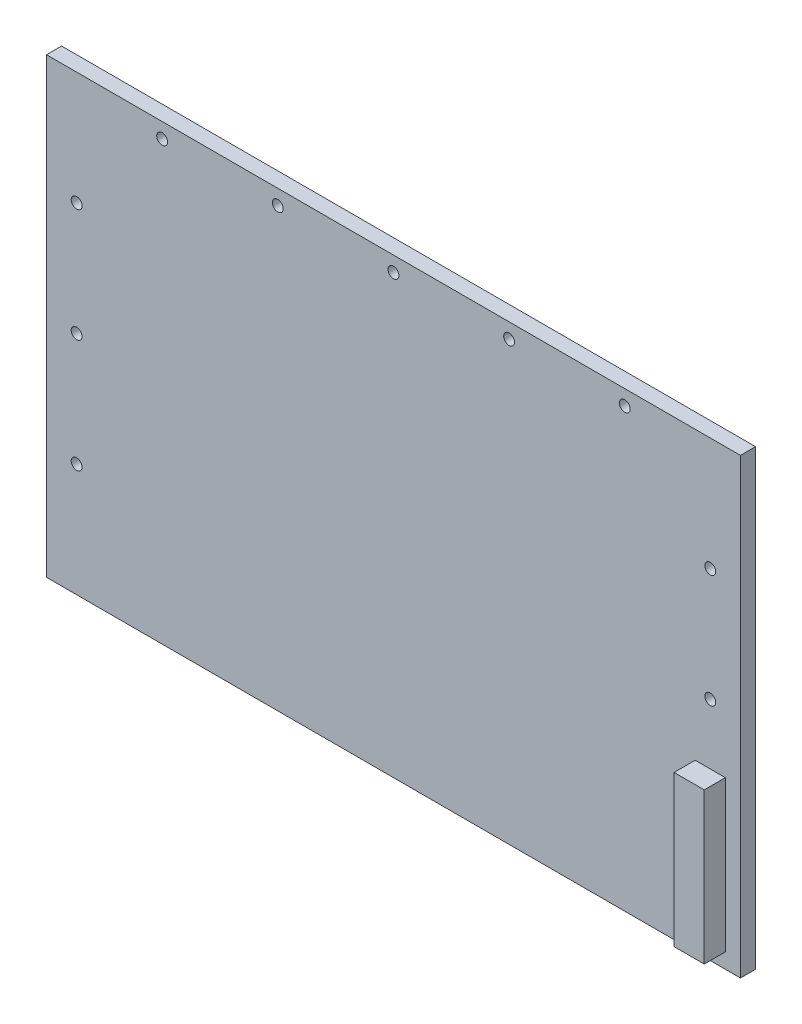
ISO-10303-21;
HEADER;
FILE_DESCRIPTION(('STEP AP214'),'2;1');
FILE_NAME('part.step','',(''),(''),'','','');
FILE_SCHEMA(('AUTOMOTIVE_DESIGN { 1 0 10303 214 1 1 1 1 }'));
ENDSEC;
DATA;
#1=APPLICATION_CONTEXT('core data for automotive mechanical design processes');
#2=APPLICATION_PROTOCOL_DEFINITION('international standard','automotive_design',2000,#1);
#3=PRODUCT_CONTEXT('',#1,'mechanical');
#4=PRODUCT('Part','Part','',(#3));
#5=PRODUCT_RELATED_PRODUCT_CATEGORY('part','',(#4));
#6=PRODUCT_DEFINITION_FORMATION('','',#4);
#7=PRODUCT_DEFINITION_CONTEXT('part definition',#1,'design');
#8=PRODUCT_DEFINITION('design','',#6,#7);
#9=PRODUCT_DEFINITION_SHAPE('','',#8);
#10=(LENGTH_UNIT() NAMED_UNIT(*) SI_UNIT(.MILLI.,.METRE.));
#11=(NAMED_UNIT(*) PLANE_ANGLE_UNIT() SI_UNIT($,.RADIAN.));
#12=(NAMED_UNIT(*) SI_UNIT($,.STERADIAN.) SOLID_ANGLE_UNIT());
#13=UNCERTAINTY_MEASURE_WITH_UNIT(LENGTH_MEASURE(1.E-05),#10,'distance_accuracy_value','');
#14=(GEOMETRIC_REPRESENTATION_CONTEXT(3) GLOBAL_UNCERTAINTY_ASSIGNED_CONTEXT((#13)) GLOBAL_UNIT_ASSIGNED_CONTEXT((#10,
#11,#12)) REPRESENTATION_CONTEXT('',''));
#15=CARTESIAN_POINT('',(0.,0.,0.));
#16=DIRECTION('',(0.,0.,1.));
#17=DIRECTION('',(1.,0.,0.));
#18=AXIS2_PLACEMENT_3D('',#15,#16,#17);
#19=CARTESIAN_POINT('',(0.,0.,5.));
#20=DIRECTION('',(0.,0.,-1.));
#21=DIRECTION('',(-1.,0.,0.));
#22=AXIS2_PLACEMENT_3D('',#19,#20,#21);
#23=PLANE('',#22);
#24=DIRECTION('',(0.,1.,0.));
#25=VECTOR('',#24,1.);
#26=CARTESIAN_POINT('',(115.,-75.,5.));
#27=LINE('',#26,#25);
#28=CARTESIAN_POINT('',(115.,-75.,5.));
#29=VERTEX_POINT('',#28);
#30=CARTESIAN_POINT('',(115.,75.,5.));
#31=VERTEX_POINT('',#30);
#32=EDGE_CURVE('E233',#29,#31,#27,.T.);
#33=ORIENTED_EDGE('',*,*,#32,.T.);
#34=DIRECTION('',(-1.,0.,0.));
#35=VECTOR('',#34,1.);
#36=CARTESIAN_POINT('',(-115.,74.9999999999999,5.));
#37=LINE('',#36,#35);
#38=CARTESIAN_POINT('',(-115.,74.9999999999999,5.));
#39=VERTEX_POINT('',#38);
#40=EDGE_CURVE('E236',#31,#39,#37,.T.);
#41=ORIENTED_EDGE('',*,*,#40,.T.);
#42=DIRECTION('',(0.,-1.,0.));
#43=VECTOR('',#42,1.);
#44=CARTESIAN_POINT('',(-115.,-75.,5.));
#45=LINE('',#44,#43);
#46=CARTESIAN_POINT('',(-115.,-75.,5.));
#47=VERTEX_POINT('',#46);
#48=EDGE_CURVE('E239',#39,#47,#45,.T.);
#49=ORIENTED_EDGE('',*,*,#48,.T.);
#50=DIRECTION('',(1.,0.,0.));
#51=VECTOR('',#50,1.);
#52=CARTESIAN_POINT('',(-115.,-75.,5.));
#53=LINE('',#52,#51);
#54=EDGE_CURVE('E241',#47,#29,#53,.T.);
#55=ORIENTED_EDGE('',*,*,#54,.T.);
#56=EDGE_LOOP('',(#33,#41,#49,#55));
#57=FACE_BOUND('',#56,.T.);
#58=CARTESIAN_POINT('',(105.,37.5,5.));
#59=DIRECTION('',(0.,0.,-1.));
#60=DIRECTION('',(-1.,0.,0.));
#61=AXIS2_PLACEMENT_3D('',#58,#59,#60);
#62=CIRCLE('',#61,1.8);
#63=CARTESIAN_POINT('',(103.2,37.5,5.));
#64=VERTEX_POINT('',#63);
#65=EDGE_CURVE('E232',#64,#64,#62,.T.);
#66=ORIENTED_EDGE('',*,*,#65,.T.);
#67=EDGE_LOOP('',(#66));
#68=FACE_BOUND('',#67,.T.);
#69=CARTESIAN_POINT('',(105.,0.,5.));
#70=DIRECTION('',(0.,0.,-1.));
#71=DIRECTION('',(-1.,0.,0.));
#72=AXIS2_PLACEMENT_3D('',#69,#70,#71);
#73=CIRCLE('',#72,1.8);
#74=CARTESIAN_POINT('',(103.2,0.,5.));
#75=VERTEX_POINT('',#74);
#76=EDGE_CURVE('E222',#75,#75,#73,.T.);
#77=ORIENTED_EDGE('',*,*,#76,.T.);
#78=EDGE_LOOP('',(#77));
#79=FACE_BOUND('',#78,.T.);
#80=CARTESIAN_POINT('',(-105.,-37.5,5.));
#81=DIRECTION('',(0.,0.,-1.));
#82=DIRECTION('',(-1.,0.,0.));
#83=AXIS2_PLACEMENT_3D('',#80,#81,#82);
#84=CIRCLE('',#83,1.8);
#85=CARTESIAN_POINT('',(-106.8,-37.5,5.));
#86=VERTEX_POINT('',#85);
#87=EDGE_CURVE('E212',#86,#86,#84,.T.);
#88=ORIENTED_EDGE('',*,*,#87,.T.);
#89=EDGE_LOOP('',(#88));
#90=FACE_BOUND('',#89,.T.);
#91=CARTESIAN_POINT('',(-105.,0.,5.));
#92=DIRECTION('',(0.,0.,-1.));
#93=DIRECTION('',(-1.,0.,0.));
#94=AXIS2_PLACEMENT_3D('',#91,#92,#93);
#95=CIRCLE('',#94,1.8);
#96=CARTESIAN_POINT('',(-106.8,0.,5.));
#97=VERTEX_POINT('',#96);
#98=EDGE_CURVE('E202',#97,#97,#95,.T.);
#99=ORIENTED_EDGE('',*,*,#98,.T.);
#100=EDGE_LOOP('',(#99));
#101=FACE_BOUND('',#100,.T.);
#102=CARTESIAN_POINT('',(-105.,37.5,5.));
#103=DIRECTION('',(0.,0.,-1.));
#104=DIRECTION('',(-1.,0.,0.));
#105=AXIS2_PLACEMENT_3D('',#102,#103,#104);
#106=CIRCLE('',#105,1.8);
#107=CARTESIAN_POINT('',(-106.8,37.5,5.));
#108=VERTEX_POINT('',#107);
#109=EDGE_CURVE('E192',#108,#108,#106,.T.);
#110=ORIENTED_EDGE('',*,*,#109,.T.);
#111=EDGE_LOOP('',(#110));
#112=FACE_BOUND('',#111,.T.);
#113=CARTESIAN_POINT('',(-76.6666666533333,70.,5.));
#114=DIRECTION('',(0.,0.,-1.));
#115=DIRECTION('',(-1.,0.,0.));
#116=AXIS2_PLACEMENT_3D('',#113,#114,#115);
#117=CIRCLE('',#116,1.8);
#118=CARTESIAN_POINT('',(-78.4666666533333,70.,5.));
#119=VERTEX_POINT('',#118);
#120=EDGE_CURVE('E182',#119,#119,#117,.T.);
#121=ORIENTED_EDGE('',*,*,#120,.T.);
#122=EDGE_LOOP('',(#121));
#123=FACE_BOUND('',#122,.T.);
#124=CARTESIAN_POINT('',(-38.3333333233333,70.,5.));
#125=DIRECTION('',(0.,0.,-1.));
#126=DIRECTION('',(-1.,0.,0.));
#127=AXIS2_PLACEMENT_3D('',#124,#125,#126);
#128=CIRCLE('',#127,1.8);
#129=CARTESIAN_POINT('',(-40.1333333233333,70.,5.));
#130=VERTEX_POINT('',#129);
#131=EDGE_CURVE('E172',#130,#130,#128,.T.);
#132=ORIENTED_EDGE('',*,*,#131,.T.);
#133=EDGE_LOOP('',(#132));
#134=FACE_BOUND('',#133,.T.);
#135=CARTESIAN_POINT('',(6.66668109605695E-09,70.,5.));
#136=DIRECTION('',(0.,0.,-1.));
#137=DIRECTION('',(-1.,0.,0.));
#138=AXIS2_PLACEMENT_3D('',#135,#136,#137);
#139=CIRCLE('',#138,1.8);
#140=CARTESIAN_POINT('',(-1.79999999333332,70.,5.));
#141=VERTEX_POINT('',#140);
#142=EDGE_CURVE('E162',#141,#141,#139,.T.);
#143=ORIENTED_EDGE('',*,*,#142,.T.);
#144=EDGE_LOOP('',(#143));
#145=FACE_BOUND('',#144,.T.);
#146=CARTESIAN_POINT('',(38.3333333366667,70.,5.));
#147=DIRECTION('',(0.,0.,-1.));
#148=DIRECTION('',(-1.,0.,0.));
#149=AXIS2_PLACEMENT_3D('',#146,#147,#148);
#150=CIRCLE('',#149,1.8);
#151=CARTESIAN_POINT('',(36.5333333366667,70.,5.));
#152=VERTEX_POINT('',#151);
#153=EDGE_CURVE('E152',#152,#152,#150,.T.);
#154=ORIENTED_EDGE('',*,*,#153,.T.);
#155=EDGE_LOOP('',(#154));
#156=FACE_BOUND('',#155,.T.);
#157=CARTESIAN_POINT('',(76.6666666666667,70.,5.));
#158=DIRECTION('',(0.,0.,-1.));
#159=DIRECTION('',(-1.,0.,0.));
#160=AXIS2_PLACEMENT_3D('',#157,#158,#159);
#161=CIRCLE('',#160,1.8);
#162=CARTESIAN_POINT('',(74.8666666666667,70.,5.));
#163=VERTEX_POINT('',#162);
#164=EDGE_CURVE('E45',#163,#163,#161,.T.);
#165=ORIENTED_EDGE('',*,*,#164,.T.);
#166=EDGE_LOOP('',(#165));
#167=FACE_BOUND('',#166,.T.);
#168=DIRECTION('',(0.,-1.,0.));
#169=VECTOR('',#168,1.);
#170=CARTESIAN_POINT('',(100.,-20.0000000000001,5.));
#171=LINE('',#170,#169);
#172=CARTESIAN_POINT('',(100.,-20.0000000000001,5.));
#173=VERTEX_POINT('',#172);
#174=CARTESIAN_POINT('',(100.,-70.0000000000001,5.));
#175=VERTEX_POINT('',#174);
#176=EDGE_CURVE('E128',#173,#175,#171,.T.);
#177=ORIENTED_EDGE('',*,*,#176,.F.);
#178=DIRECTION('',(-1.,0.,0.));
#179=VECTOR('',#178,1.);
#180=CARTESIAN_POINT('',(110.,-20.0000000000001,5.));
#181=LINE('',#180,#179);
#182=CARTESIAN_POINT('',(110.,-20.0000000000001,5.));
#183=VERTEX_POINT('',#182);
#184=EDGE_CURVE('E125',#183,#173,#181,.T.);
#185=ORIENTED_EDGE('',*,*,#184,.F.);
#186=DIRECTION('',(0.,1.,0.));
#187=VECTOR('',#186,1.);
#188=CARTESIAN_POINT('',(110.,-70.0000000000001,5.));
#189=LINE('',#188,#187);
#190=CARTESIAN_POINT('',(110.,-70.0000000000001,5.));
#191=VERTEX_POINT('',#190);
#192=EDGE_CURVE('E63',#191,#183,#189,.T.);
#193=ORIENTED_EDGE('',*,*,#192,.F.);
#194=DIRECTION('',(1.,0.,0.));
#195=VECTOR('',#194,1.);
#196=CARTESIAN_POINT('',(100.,-70.0000000000001,5.));
#197=LINE('',#196,#195);
#198=EDGE_CURVE('E58',#175,#191,#197,.T.);
#199=ORIENTED_EDGE('',*,*,#198,.F.);
#200=EDGE_LOOP('',(#177,#185,#193,#199));
#201=FACE_BOUND('',#200,.T.);
#202=ADVANCED_FACE('F41',(#57,#68,#79,#90,#101,#112,#123,#134,#145,#156,#167,#201),#23,.F.);
#203=CARTESIAN_POINT('',(115.,-75.,5.));
#204=DIRECTION('',(-1.,0.,0.));
#205=DIRECTION('',(0.,0.,1.));
#206=AXIS2_PLACEMENT_3D('',#203,#204,#205);
#207=PLANE('',#206);
#208=DIRECTION('',(0.,1.,0.));
#209=VECTOR('',#208,1.);
#210=CARTESIAN_POINT('',(115.,-75.,0.));
#211=LINE('',#210,#209);
#212=CARTESIAN_POINT('',(115.,-75.,0.));
#213=VERTEX_POINT('',#212);
#214=CARTESIAN_POINT('',(115.,75.,0.));
#215=VERTEX_POINT('',#214);
#216=EDGE_CURVE('E244',#213,#215,#211,.T.);
#217=ORIENTED_EDGE('',*,*,#216,.T.);
#218=DIRECTION('',(0.,0.,-1.));
#219=VECTOR('',#218,1.);
#220=CARTESIAN_POINT('',(115.,75.,5.));
#221=LINE('',#220,#219);
#222=EDGE_CURVE('E11',#31,#215,#221,.T.);
#223=ORIENTED_EDGE('',*,*,#222,.F.);
#224=ORIENTED_EDGE('',*,*,#32,.F.);
#225=DIRECTION('',(0.,0.,-1.));
#226=VECTOR('',#225,1.);
#227=CARTESIAN_POINT('',(115.,-75.,5.));
#228=LINE('',#227,#226);
#229=EDGE_CURVE('E243',#29,#213,#228,.T.);
#230=ORIENTED_EDGE('',*,*,#229,.T.);
#231=EDGE_LOOP('',(#217,#223,#224,#230));
#232=FACE_BOUND('',#231,.T.);
#233=ADVANCED_FACE('F43',(#232),#207,.F.);
#234=CARTESIAN_POINT('',(-115.,74.9999999999999,5.));
#235=DIRECTION('',(0.,-1.,0.));
#236=DIRECTION('',(1.,0.,0.));
#237=AXIS2_PLACEMENT_3D('',#234,#235,#236);
#238=PLANE('',#237);
#239=DIRECTION('',(-1.,0.,0.));
#240=VECTOR('',#239,1.);
#241=CARTESIAN_POINT('',(-115.,74.9999999999999,0.));
#242=LINE('',#241,#240);
#243=CARTESIAN_POINT('',(-115.,74.9999999999999,0.));
#244=VERTEX_POINT('',#243);
#245=EDGE_CURVE('E247',#215,#244,#242,.T.);
#246=ORIENTED_EDGE('',*,*,#245,.T.);
#247=DIRECTION('',(0.,0.,-1.));
#248=VECTOR('',#247,1.);
#249=CARTESIAN_POINT('',(-115.,74.9999999999999,5.));
#250=LINE('',#249,#248);
#251=EDGE_CURVE('E50',#39,#244,#250,.T.);
#252=ORIENTED_EDGE('',*,*,#251,.F.);
#253=ORIENTED_EDGE('',*,*,#40,.F.);
#254=ORIENTED_EDGE('',*,*,#222,.T.);
#255=EDGE_LOOP('',(#246,#252,#253,#254));
#256=FACE_BOUND('',#255,.T.);
#257=ADVANCED_FACE('F303',(#256),#238,.F.);
#258=CARTESIAN_POINT('',(-115.,-75.,5.));
#259=DIRECTION('',(1.,0.,0.));
#260=DIRECTION('',(0.,1.,0.));
#261=AXIS2_PLACEMENT_3D('',#258,#259,#260);
#262=PLANE('',#261);
#263=DIRECTION('',(0.,-1.,0.));
#264=VECTOR('',#263,1.);
#265=CARTESIAN_POINT('',(-115.,-75.,0.));
#266=LINE('',#265,#264);
#267=CARTESIAN_POINT('',(-115.,-75.,0.));
#268=VERTEX_POINT('',#267);
#269=EDGE_CURVE('E249',#244,#268,#266,.T.);
#270=ORIENTED_EDGE('',*,*,#269,.T.);
#271=DIRECTION('',(0.,0.,-1.));
#272=VECTOR('',#271,1.);
#273=CARTESIAN_POINT('',(-115.,-75.,5.));
#274=LINE('',#273,#272);
#275=EDGE_CURVE('E254',#47,#268,#274,.T.);
#276=ORIENTED_EDGE('',*,*,#275,.F.);
#277=ORIENTED_EDGE('',*,*,#48,.F.);
#278=ORIENTED_EDGE('',*,*,#251,.T.);
#279=EDGE_LOOP('',(#270,#276,#277,#278));
#280=FACE_BOUND('',#279,.T.);
#281=ADVANCED_FACE('F317',(#280),#262,.F.);
#282=CARTESIAN_POINT('',(-115.,-75.,5.));
#283=DIRECTION('',(0.,1.,0.));
#284=DIRECTION('',(-1.,0.,0.));
#285=AXIS2_PLACEMENT_3D('',#282,#283,#284);
#286=PLANE('',#285);
#287=DIRECTION('',(1.,0.,0.));
#288=VECTOR('',#287,1.);
#289=CARTESIAN_POINT('',(-115.,-75.,0.));
#290=LINE('',#289,#288);
#291=EDGE_CURVE('E237',#268,#213,#290,.T.);
#292=ORIENTED_EDGE('',*,*,#291,.T.);
#293=ORIENTED_EDGE('',*,*,#229,.F.);
#294=ORIENTED_EDGE('',*,*,#54,.F.);
#295=ORIENTED_EDGE('',*,*,#275,.T.);
#296=EDGE_LOOP('',(#292,#293,#294,#295));
#297=FACE_BOUND('',#296,.T.);
#298=ADVANCED_FACE('F313',(#297),#286,.F.);
#299=CARTESIAN_POINT('',(0.,0.,0.));
#300=DIRECTION('',(0.,0.,-1.));
#301=DIRECTION('',(-1.,0.,0.));
#302=AXIS2_PLACEMENT_3D('',#299,#300,#301);
#303=PLANE('',#302);
#304=CARTESIAN_POINT('',(76.6666666666667,70.,0.));
#305=DIRECTION('',(0.,0.,-1.));
#306=DIRECTION('',(-1.,0.,0.));
#307=AXIS2_PLACEMENT_3D('',#304,#305,#306);
#308=CIRCLE('',#307,3.5);
#309=CARTESIAN_POINT('',(73.1666666666667,70.,0.));
#310=VERTEX_POINT('',#309);
#311=EDGE_CURVE('E129',#310,#310,#308,.T.);
#312=ORIENTED_EDGE('',*,*,#311,.F.);
#313=EDGE_LOOP('',(#312));
#314=FACE_BOUND('',#313,.T.);
#315=CARTESIAN_POINT('',(38.3333333366667,70.,0.));
#316=DIRECTION('',(0.,0.,-1.));
#317=DIRECTION('',(-1.,0.,0.));
#318=AXIS2_PLACEMENT_3D('',#315,#316,#317);
#319=CIRCLE('',#318,3.5);
#320=CARTESIAN_POINT('',(34.8333333366667,70.,0.));
#321=VERTEX_POINT('',#320);
#322=EDGE_CURVE('E143',#321,#321,#319,.T.);
#323=ORIENTED_EDGE('',*,*,#322,.F.);
#324=EDGE_LOOP('',(#323));
#325=FACE_BOUND('',#324,.T.);
#326=CARTESIAN_POINT('',(6.66668109605695E-09,70.,0.));
#327=DIRECTION('',(0.,0.,-1.));
#328=DIRECTION('',(-1.,0.,0.));
#329=AXIS2_PLACEMENT_3D('',#326,#327,#328);
#330=CIRCLE('',#329,3.5);
#331=CARTESIAN_POINT('',(-3.49999999333332,70.,0.));
#332=VERTEX_POINT('',#331);
#333=EDGE_CURVE('E153',#332,#332,#330,.T.);
#334=ORIENTED_EDGE('',*,*,#333,.F.);
#335=EDGE_LOOP('',(#334));
#336=FACE_BOUND('',#335,.T.);
#337=CARTESIAN_POINT('',(-38.3333333233333,70.,0.));
#338=DIRECTION('',(0.,0.,-1.));
#339=DIRECTION('',(-1.,0.,0.));
#340=AXIS2_PLACEMENT_3D('',#337,#338,#339);
#341=CIRCLE('',#340,3.5);
#342=CARTESIAN_POINT('',(-41.8333333233333,70.,0.));
#343=VERTEX_POINT('',#342);
#344=EDGE_CURVE('E163',#343,#343,#341,.T.);
#345=ORIENTED_EDGE('',*,*,#344,.F.);
#346=EDGE_LOOP('',(#345));
#347=FACE_BOUND('',#346,.T.);
#348=CARTESIAN_POINT('',(-76.6666666533333,70.,0.));
#349=DIRECTION('',(0.,0.,-1.));
#350=DIRECTION('',(-1.,0.,0.));
#351=AXIS2_PLACEMENT_3D('',#348,#349,#350);
#352=CIRCLE('',#351,3.5);
#353=CARTESIAN_POINT('',(-80.1666666533333,70.,0.));
#354=VERTEX_POINT('',#353);
#355=EDGE_CURVE('E173',#354,#354,#352,.T.);
#356=ORIENTED_EDGE('',*,*,#355,.F.);
#357=EDGE_LOOP('',(#356));
#358=FACE_BOUND('',#357,.T.);
#359=CARTESIAN_POINT('',(-105.,37.5,0.));
#360=DIRECTION('',(0.,0.,-1.));
#361=DIRECTION('',(-1.,0.,0.));
#362=AXIS2_PLACEMENT_3D('',#359,#360,#361);
#363=CIRCLE('',#362,3.5);
#364=CARTESIAN_POINT('',(-108.5,37.5,0.));
#365=VERTEX_POINT('',#364);
#366=EDGE_CURVE('E183',#365,#365,#363,.T.);
#367=ORIENTED_EDGE('',*,*,#366,.F.);
#368=EDGE_LOOP('',(#367));
#369=FACE_BOUND('',#368,.T.);
#370=CARTESIAN_POINT('',(-105.,0.,0.));
#371=DIRECTION('',(0.,0.,-1.));
#372=DIRECTION('',(-1.,0.,0.));
#373=AXIS2_PLACEMENT_3D('',#370,#371,#372);
#374=CIRCLE('',#373,3.5);
#375=CARTESIAN_POINT('',(-108.5,0.,0.));
#376=VERTEX_POINT('',#375);
#377=EDGE_CURVE('E193',#376,#376,#374,.T.);
#378=ORIENTED_EDGE('',*,*,#377,.F.);
#379=EDGE_LOOP('',(#378));
#380=FACE_BOUND('',#379,.T.);
#381=CARTESIAN_POINT('',(-105.,-37.5,0.));
#382=DIRECTION('',(0.,0.,-1.));
#383=DIRECTION('',(-1.,0.,0.));
#384=AXIS2_PLACEMENT_3D('',#381,#382,#383);
#385=CIRCLE('',#384,3.5);
#386=CARTESIAN_POINT('',(-108.5,-37.5,0.));
#387=VERTEX_POINT('',#386);
#388=EDGE_CURVE('E203',#387,#387,#385,.T.);
#389=ORIENTED_EDGE('',*,*,#388,.F.);
#390=EDGE_LOOP('',(#389));
#391=FACE_BOUND('',#390,.T.);
#392=CARTESIAN_POINT('',(105.,0.,0.));
#393=DIRECTION('',(0.,0.,-1.));
#394=DIRECTION('',(-1.,0.,0.));
#395=AXIS2_PLACEMENT_3D('',#392,#393,#394);
#396=CIRCLE('',#395,3.5);
#397=CARTESIAN_POINT('',(101.5,0.,0.));
#398=VERTEX_POINT('',#397);
#399=EDGE_CURVE('E213',#398,#398,#396,.T.);
#400=ORIENTED_EDGE('',*,*,#399,.F.);
#401=EDGE_LOOP('',(#400));
#402=FACE_BOUND('',#401,.T.);
#403=CARTESIAN_POINT('',(105.,37.5,0.));
#404=DIRECTION('',(0.,0.,-1.));
#405=DIRECTION('',(-1.,0.,0.));
#406=AXIS2_PLACEMENT_3D('',#403,#404,#405);
#407=CIRCLE('',#406,3.5);
#408=CARTESIAN_POINT('',(101.5,37.5,0.));
#409=VERTEX_POINT('',#408);
#410=EDGE_CURVE('E223',#409,#409,#407,.T.);
#411=ORIENTED_EDGE('',*,*,#410,.F.);
#412=EDGE_LOOP('',(#411));
#413=FACE_BOUND('',#412,.T.);
#414=ORIENTED_EDGE('',*,*,#216,.F.);
#415=ORIENTED_EDGE('',*,*,#291,.F.);
#416=ORIENTED_EDGE('',*,*,#269,.F.);
#417=ORIENTED_EDGE('',*,*,#245,.F.);
#418=EDGE_LOOP('',(#414,#415,#416,#417));
#419=FACE_BOUND('',#418,.T.);
#420=ADVANCED_FACE('F310',(#314,#325,#336,#347,#358,#369,#380,#391,#402,#413,#419),#303,.T.);
#421=CARTESIAN_POINT('',(105.,37.5,0.));
#422=DIRECTION('',(0.,0.,-1.));
#423=DIRECTION('',(-1.,0.,0.));
#424=AXIS2_PLACEMENT_3D('',#421,#422,#423);
#425=CYLINDRICAL_SURFACE('',#424,1.8);
#426=CARTESIAN_POINT('',(105.,37.5,2.4));
#427=DIRECTION('',(0.,0.,-1.));
#428=DIRECTION('',(-1.,0.,0.));
#429=AXIS2_PLACEMENT_3D('',#426,#427,#428);
#430=CIRCLE('',#429,1.8);
#431=CARTESIAN_POINT('',(103.2,37.5,2.4));
#432=VERTEX_POINT('',#431);
#433=EDGE_CURVE('E229',#432,#432,#430,.T.);
#434=ORIENTED_EDGE('',*,*,#433,.T.);
#435=EDGE_LOOP('',(#434));
#436=FACE_BOUND('',#435,.T.);
#437=ORIENTED_EDGE('',*,*,#65,.F.);
#438=EDGE_LOOP('',(#437));
#439=FACE_BOUND('',#438,.T.);
#440=ADVANCED_FACE('F308',(#436,#439),#425,.F.);
#441=CARTESIAN_POINT('',(106.8,37.5,2.4));
#442=DIRECTION('',(0.,0.,1.));
#443=DIRECTION('',(1.,0.,0.));
#444=AXIS2_PLACEMENT_3D('',#441,#442,#443);
#445=PLANE('',#444);
#446=ORIENTED_EDGE('',*,*,#433,.F.);
#447=EDGE_LOOP('',(#446));
#448=FACE_BOUND('',#447,.T.);
#449=CARTESIAN_POINT('',(105.,37.5,2.4));
#450=DIRECTION('',(0.,0.,-1.));
#451=DIRECTION('',(-1.,0.,0.));
#452=AXIS2_PLACEMENT_3D('',#449,#450,#451);
#453=CIRCLE('',#452,3.5);
#454=CARTESIAN_POINT('',(101.5,37.5,2.4));
#455=VERTEX_POINT('',#454);
#456=EDGE_CURVE('E226',#455,#455,#453,.T.);
#457=ORIENTED_EDGE('',*,*,#456,.T.);
#458=EDGE_LOOP('',(#457));
#459=FACE_BOUND('',#458,.T.);
#460=ADVANCED_FACE('F356',(#448,#459),#445,.F.);
#461=CARTESIAN_POINT('',(105.,37.5,0.));
#462=DIRECTION('',(0.,0.,-1.));
#463=DIRECTION('',(-1.,0.,0.));
#464=AXIS2_PLACEMENT_3D('',#461,#462,#463);
#465=CYLINDRICAL_SURFACE('',#464,3.5);
#466=ORIENTED_EDGE('',*,*,#456,.F.);
#467=EDGE_LOOP('',(#466));
#468=FACE_BOUND('',#467,.T.);
#469=ORIENTED_EDGE('',*,*,#410,.T.);
#470=EDGE_LOOP('',(#469));
#471=FACE_BOUND('',#470,.T.);
#472=ADVANCED_FACE('F364',(#468,#471),#465,.F.);
#473=CARTESIAN_POINT('',(105.,0.,0.));
#474=DIRECTION('',(0.,0.,-1.));
#475=DIRECTION('',(-1.,0.,0.));
#476=AXIS2_PLACEMENT_3D('',#473,#474,#475);
#477=CYLINDRICAL_SURFACE('',#476,1.8);
#478=CARTESIAN_POINT('',(105.,0.,2.4));
#479=DIRECTION('',(0.,0.,-1.));
#480=DIRECTION('',(-1.,0.,0.));
#481=AXIS2_PLACEMENT_3D('',#478,#479,#480);
#482=CIRCLE('',#481,1.8);
#483=CARTESIAN_POINT('',(103.2,0.,2.4));
#484=VERTEX_POINT('',#483);
#485=EDGE_CURVE('E219',#484,#484,#482,.T.);
#486=ORIENTED_EDGE('',*,*,#485,.T.);
#487=EDGE_LOOP('',(#486));
#488=FACE_BOUND('',#487,.T.);
#489=ORIENTED_EDGE('',*,*,#76,.F.);
#490=EDGE_LOOP('',(#489));
#491=FACE_BOUND('',#490,.T.);
#492=ADVANCED_FACE('F372',(#488,#491),#477,.F.);
#493=CARTESIAN_POINT('',(106.8,0.,2.4));
#494=DIRECTION('',(0.,0.,1.));
#495=DIRECTION('',(1.,0.,0.));
#496=AXIS2_PLACEMENT_3D('',#493,#494,#495);
#497=PLANE('',#496);
#498=ORIENTED_EDGE('',*,*,#485,.F.);
#499=EDGE_LOOP('',(#498));
#500=FACE_BOUND('',#499,.T.);
#501=CARTESIAN_POINT('',(105.,0.,2.4));
#502=DIRECTION('',(0.,0.,-1.));
#503=DIRECTION('',(-1.,0.,0.));
#504=AXIS2_PLACEMENT_3D('',#501,#502,#503);
#505=CIRCLE('',#504,3.5);
#506=CARTESIAN_POINT('',(101.5,0.,2.4));
#507=VERTEX_POINT('',#506);
#508=EDGE_CURVE('E216',#507,#507,#505,.T.);
#509=ORIENTED_EDGE('',*,*,#508,.T.);
#510=EDGE_LOOP('',(#509));
#511=FACE_BOUND('',#510,.T.);
#512=ADVANCED_FACE('F381',(#500,#511),#497,.F.);
#513=CARTESIAN_POINT('',(105.,0.,0.));
#514=DIRECTION('',(0.,0.,-1.));
#515=DIRECTION('',(-1.,0.,0.));
#516=AXIS2_PLACEMENT_3D('',#513,#514,#515);
#517=CYLINDRICAL_SURFACE('',#516,3.5);
#518=ORIENTED_EDGE('',*,*,#508,.F.);
#519=EDGE_LOOP('',(#518));
#520=FACE_BOUND('',#519,.T.);
#521=ORIENTED_EDGE('',*,*,#399,.T.);
#522=EDGE_LOOP('',(#521));
#523=FACE_BOUND('',#522,.T.);
#524=ADVANCED_FACE('F390',(#520,#523),#517,.F.);
#525=CARTESIAN_POINT('',(-105.,-37.5,0.));
#526=DIRECTION('',(0.,0.,-1.));
#527=DIRECTION('',(-1.,0.,0.));
#528=AXIS2_PLACEMENT_3D('',#525,#526,#527);
#529=CYLINDRICAL_SURFACE('',#528,1.8);
#530=CARTESIAN_POINT('',(-105.,-37.5,2.4));
#531=DIRECTION('',(0.,0.,-1.));
#532=DIRECTION('',(-1.,0.,0.));
#533=AXIS2_PLACEMENT_3D('',#530,#531,#532);
#534=CIRCLE('',#533,1.8);
#535=CARTESIAN_POINT('',(-106.8,-37.5,2.4));
#536=VERTEX_POINT('',#535);
#537=EDGE_CURVE('E209',#536,#536,#534,.T.);
#538=ORIENTED_EDGE('',*,*,#537,.T.);
#539=EDGE_LOOP('',(#538));
#540=FACE_BOUND('',#539,.T.);
#541=ORIENTED_EDGE('',*,*,#87,.F.);
#542=EDGE_LOOP('',(#541));
#543=FACE_BOUND('',#542,.T.);
#544=ADVANCED_FACE('F399',(#540,#543),#529,.F.);
#545=CARTESIAN_POINT('',(-103.2,-37.5,2.4));
#546=DIRECTION('',(0.,0.,1.));
#547=DIRECTION('',(1.,0.,0.));
#548=AXIS2_PLACEMENT_3D('',#545,#546,#547);
#549=PLANE('',#548);
#550=ORIENTED_EDGE('',*,*,#537,.F.);
#551=EDGE_LOOP('',(#550));
#552=FACE_BOUND('',#551,.T.);
#553=CARTESIAN_POINT('',(-105.,-37.5,2.4));
#554=DIRECTION('',(0.,0.,-1.));
#555=DIRECTION('',(-1.,0.,0.));
#556=AXIS2_PLACEMENT_3D('',#553,#554,#555);
#557=CIRCLE('',#556,3.5);
#558=CARTESIAN_POINT('',(-108.5,-37.5,2.4));
#559=VERTEX_POINT('',#558);
#560=EDGE_CURVE('E206',#559,#559,#557,.T.);
#561=ORIENTED_EDGE('',*,*,#560,.T.);
#562=EDGE_LOOP('',(#561));
#563=FACE_BOUND('',#562,.T.);
#564=ADVANCED_FACE('F408',(#552,#563),#549,.F.);
#565=CARTESIAN_POINT('',(-105.,-37.5,0.));
#566=DIRECTION('',(0.,0.,-1.));
#567=DIRECTION('',(-1.,0.,0.));
#568=AXIS2_PLACEMENT_3D('',#565,#566,#567);
#569=CYLINDRICAL_SURFACE('',#568,3.5);
#570=ORIENTED_EDGE('',*,*,#560,.F.);
#571=EDGE_LOOP('',(#570));
#572=FACE_BOUND('',#571,.T.);
#573=ORIENTED_EDGE('',*,*,#388,.T.);
#574=EDGE_LOOP('',(#573));
#575=FACE_BOUND('',#574,.T.);
#576=ADVANCED_FACE('F417',(#572,#575),#569,.F.);
#577=CARTESIAN_POINT('',(-105.,0.,0.));
#578=DIRECTION('',(0.,0.,-1.));
#579=DIRECTION('',(-1.,0.,0.));
#580=AXIS2_PLACEMENT_3D('',#577,#578,#579);
#581=CYLINDRICAL_SURFACE('',#580,1.8);
#582=CARTESIAN_POINT('',(-105.,0.,2.4));
#583=DIRECTION('',(0.,0.,-1.));
#584=DIRECTION('',(-1.,0.,0.));
#585=AXIS2_PLACEMENT_3D('',#582,#583,#584);
#586=CIRCLE('',#585,1.8);
#587=CARTESIAN_POINT('',(-106.8,0.,2.4));
#588=VERTEX_POINT('',#587);
#589=EDGE_CURVE('E199',#588,#588,#586,.T.);
#590=ORIENTED_EDGE('',*,*,#589,.T.);
#591=EDGE_LOOP('',(#590));
#592=FACE_BOUND('',#591,.T.);
#593=ORIENTED_EDGE('',*,*,#98,.F.);
#594=EDGE_LOOP('',(#593));
#595=FACE_BOUND('',#594,.T.);
#596=ADVANCED_FACE('F426',(#592,#595),#581,.F.);
#597=CARTESIAN_POINT('',(-103.2,0.,2.4));
#598=DIRECTION('',(0.,0.,1.));
#599=DIRECTION('',(1.,0.,0.));
#600=AXIS2_PLACEMENT_3D('',#597,#598,#599);
#601=PLANE('',#600);
#602=ORIENTED_EDGE('',*,*,#589,.F.);
#603=EDGE_LOOP('',(#602));
#604=FACE_BOUND('',#603,.T.);
#605=CARTESIAN_POINT('',(-105.,0.,2.4));
#606=DIRECTION('',(0.,0.,-1.));
#607=DIRECTION('',(-1.,0.,0.));
#608=AXIS2_PLACEMENT_3D('',#605,#606,#607);
#609=CIRCLE('',#608,3.5);
#610=CARTESIAN_POINT('',(-108.5,0.,2.4));
#611=VERTEX_POINT('',#610);
#612=EDGE_CURVE('E196',#611,#611,#609,.T.);
#613=ORIENTED_EDGE('',*,*,#612,.T.);
#614=EDGE_LOOP('',(#613));
#615=FACE_BOUND('',#614,.T.);
#616=ADVANCED_FACE('F435',(#604,#615),#601,.F.);
#617=CARTESIAN_POINT('',(-105.,0.,0.));
#618=DIRECTION('',(0.,0.,-1.));
#619=DIRECTION('',(-1.,0.,0.));
#620=AXIS2_PLACEMENT_3D('',#617,#618,#619);
#621=CYLINDRICAL_SURFACE('',#620,3.5);
#622=ORIENTED_EDGE('',*,*,#612,.F.);
#623=EDGE_LOOP('',(#622));
#624=FACE_BOUND('',#623,.T.);
#625=ORIENTED_EDGE('',*,*,#377,.T.);
#626=EDGE_LOOP('',(#625));
#627=FACE_BOUND('',#626,.T.);
#628=ADVANCED_FACE('F444',(#624,#627),#621,.F.);
#629=CARTESIAN_POINT('',(-105.,37.5,0.));
#630=DIRECTION('',(0.,0.,-1.));
#631=DIRECTION('',(-1.,0.,0.));
#632=AXIS2_PLACEMENT_3D('',#629,#630,#631);
#633=CYLINDRICAL_SURFACE('',#632,1.8);
#634=CARTESIAN_POINT('',(-105.,37.5,2.4));
#635=DIRECTION('',(0.,0.,-1.));
#636=DIRECTION('',(-1.,0.,0.));
#637=AXIS2_PLACEMENT_3D('',#634,#635,#636);
#638=CIRCLE('',#637,1.8);
#639=CARTESIAN_POINT('',(-106.8,37.5,2.4));
#640=VERTEX_POINT('',#639);
#641=EDGE_CURVE('E189',#640,#640,#638,.T.);
#642=ORIENTED_EDGE('',*,*,#641,.T.);
#643=EDGE_LOOP('',(#642));
#644=FACE_BOUND('',#643,.T.);
#645=ORIENTED_EDGE('',*,*,#109,.F.);
#646=EDGE_LOOP('',(#645));
#647=FACE_BOUND('',#646,.T.);
#648=ADVANCED_FACE('F453',(#644,#647),#633,.F.);
#649=CARTESIAN_POINT('',(-103.2,37.5,2.4));
#650=DIRECTION('',(0.,0.,1.));
#651=DIRECTION('',(1.,0.,0.));
#652=AXIS2_PLACEMENT_3D('',#649,#650,#651);
#653=PLANE('',#652);
#654=ORIENTED_EDGE('',*,*,#641,.F.);
#655=EDGE_LOOP('',(#654));
#656=FACE_BOUND('',#655,.T.);
#657=CARTESIAN_POINT('',(-105.,37.5,2.4));
#658=DIRECTION('',(0.,0.,-1.));
#659=DIRECTION('',(-1.,0.,0.));
#660=AXIS2_PLACEMENT_3D('',#657,#658,#659);
#661=CIRCLE('',#660,3.5);
#662=CARTESIAN_POINT('',(-108.5,37.5,2.4));
#663=VERTEX_POINT('',#662);
#664=EDGE_CURVE('E186',#663,#663,#661,.T.);
#665=ORIENTED_EDGE('',*,*,#664,.T.);
#666=EDGE_LOOP('',(#665));
#667=FACE_BOUND('',#666,.T.);
#668=ADVANCED_FACE('F462',(#656,#667),#653,.F.);
#669=CARTESIAN_POINT('',(-105.,37.5,0.));
#670=DIRECTION('',(0.,0.,-1.));
#671=DIRECTION('',(-1.,0.,0.));
#672=AXIS2_PLACEMENT_3D('',#669,#670,#671);
#673=CYLINDRICAL_SURFACE('',#672,3.5);
#674=ORIENTED_EDGE('',*,*,#664,.F.);
#675=EDGE_LOOP('',(#674));
#676=FACE_BOUND('',#675,.T.);
#677=ORIENTED_EDGE('',*,*,#366,.T.);
#678=EDGE_LOOP('',(#677));
#679=FACE_BOUND('',#678,.T.);
#680=ADVANCED_FACE('F471',(#676,#679),#673,.F.);
#681=CARTESIAN_POINT('',(-76.6666666533333,70.,0.));
#682=DIRECTION('',(0.,0.,-1.));
#683=DIRECTION('',(-1.,0.,0.));
#684=AXIS2_PLACEMENT_3D('',#681,#682,#683);
#685=CYLINDRICAL_SURFACE('',#684,1.8);
#686=CARTESIAN_POINT('',(-76.6666666533333,70.,2.4));
#687=DIRECTION('',(0.,0.,-1.));
#688=DIRECTION('',(-1.,0.,0.));
#689=AXIS2_PLACEMENT_3D('',#686,#687,#688);
#690=CIRCLE('',#689,1.8);
#691=CARTESIAN_POINT('',(-78.4666666533333,70.,2.4));
#692=VERTEX_POINT('',#691);
#693=EDGE_CURVE('E179',#692,#692,#690,.T.);
#694=ORIENTED_EDGE('',*,*,#693,.T.);
#695=EDGE_LOOP('',(#694));
#696=FACE_BOUND('',#695,.T.);
#697=ORIENTED_EDGE('',*,*,#120,.F.);
#698=EDGE_LOOP('',(#697));
#699=FACE_BOUND('',#698,.T.);
#700=ADVANCED_FACE('F479',(#696,#699),#685,.F.);
#701=CARTESIAN_POINT('',(-74.8666666533333,70.,2.4));
#702=DIRECTION('',(0.,0.,1.));
#703=DIRECTION('',(1.,0.,0.));
#704=AXIS2_PLACEMENT_3D('',#701,#702,#703);
#705=PLANE('',#704);
#706=ORIENTED_EDGE('',*,*,#693,.F.);
#707=EDGE_LOOP('',(#706));
#708=FACE_BOUND('',#707,.T.);
#709=CARTESIAN_POINT('',(-76.6666666533333,70.,2.4));
#710=DIRECTION('',(0.,0.,-1.));
#711=DIRECTION('',(-1.,0.,0.));
#712=AXIS2_PLACEMENT_3D('',#709,#710,#711);
#713=CIRCLE('',#712,3.5);
#714=CARTESIAN_POINT('',(-80.1666666533333,70.,2.4));
#715=VERTEX_POINT('',#714);
#716=EDGE_CURVE('E176',#715,#715,#713,.T.);
#717=ORIENTED_EDGE('',*,*,#716,.T.);
#718=EDGE_LOOP('',(#717));
#719=FACE_BOUND('',#718,.T.);
#720=ADVANCED_FACE('F493',(#708,#719),#705,.F.);
#721=CARTESIAN_POINT('',(-76.6666666533333,70.,0.));
#722=DIRECTION('',(0.,0.,-1.));
#723=DIRECTION('',(-1.,0.,0.));
#724=AXIS2_PLACEMENT_3D('',#721,#722,#723);
#725=CYLINDRICAL_SURFACE('',#724,3.5);
#726=ORIENTED_EDGE('',*,*,#716,.F.);
#727=EDGE_LOOP('',(#726));
#728=FACE_BOUND('',#727,.T.);
#729=ORIENTED_EDGE('',*,*,#355,.T.);
#730=EDGE_LOOP('',(#729));
#731=FACE_BOUND('',#730,.T.);
#732=ADVANCED_FACE('F502',(#728,#731),#725,.F.);
#733=CARTESIAN_POINT('',(-38.3333333233333,70.,0.));
#734=DIRECTION('',(0.,0.,-1.));
#735=DIRECTION('',(-1.,0.,0.));
#736=AXIS2_PLACEMENT_3D('',#733,#734,#735);
#737=CYLINDRICAL_SURFACE('',#736,1.8);
#738=CARTESIAN_POINT('',(-38.3333333233333,70.,2.4));
#739=DIRECTION('',(0.,0.,-1.));
#740=DIRECTION('',(-1.,0.,0.));
#741=AXIS2_PLACEMENT_3D('',#738,#739,#740);
#742=CIRCLE('',#741,1.8);
#743=CARTESIAN_POINT('',(-40.1333333233333,70.,2.4));
#744=VERTEX_POINT('',#743);
#745=EDGE_CURVE('E169',#744,#744,#742,.T.);
#746=ORIENTED_EDGE('',*,*,#745,.T.);
#747=EDGE_LOOP('',(#746));
#748=FACE_BOUND('',#747,.T.);
#749=ORIENTED_EDGE('',*,*,#131,.F.);
#750=EDGE_LOOP('',(#749));
#751=FACE_BOUND('',#750,.T.);
#752=ADVANCED_FACE('F511',(#748,#751),#737,.F.);
#753=CARTESIAN_POINT('',(-36.5333333233333,70.,2.4));
#754=DIRECTION('',(0.,0.,1.));
#755=DIRECTION('',(1.,0.,0.));
#756=AXIS2_PLACEMENT_3D('',#753,#754,#755);
#757=PLANE('',#756);
#758=ORIENTED_EDGE('',*,*,#745,.F.);
#759=EDGE_LOOP('',(#758));
#760=FACE_BOUND('',#759,.T.);
#761=CARTESIAN_POINT('',(-38.3333333233333,70.,2.4));
#762=DIRECTION('',(0.,0.,-1.));
#763=DIRECTION('',(-1.,0.,0.));
#764=AXIS2_PLACEMENT_3D('',#761,#762,#763);
#765=CIRCLE('',#764,3.5);
#766=CARTESIAN_POINT('',(-41.8333333233333,70.,2.4));
#767=VERTEX_POINT('',#766);
#768=EDGE_CURVE('E166',#767,#767,#765,.T.);
#769=ORIENTED_EDGE('',*,*,#768,.T.);
#770=EDGE_LOOP('',(#769));
#771=FACE_BOUND('',#770,.T.);
#772=ADVANCED_FACE('F520',(#760,#771),#757,.F.);
#773=CARTESIAN_POINT('',(-38.3333333233333,70.,0.));
#774=DIRECTION('',(0.,0.,-1.));
#775=DIRECTION('',(-1.,0.,0.));
#776=AXIS2_PLACEMENT_3D('',#773,#774,#775);
#777=CYLINDRICAL_SURFACE('',#776,3.5);
#778=ORIENTED_EDGE('',*,*,#768,.F.);
#779=EDGE_LOOP('',(#778));
#780=FACE_BOUND('',#779,.T.);
#781=ORIENTED_EDGE('',*,*,#344,.T.);
#782=EDGE_LOOP('',(#781));
#783=FACE_BOUND('',#782,.T.);
#784=ADVANCED_FACE('F529',(#780,#783),#777,.F.);
#785=CARTESIAN_POINT('',(6.66668109605695E-09,70.,0.));
#786=DIRECTION('',(0.,0.,-1.));
#787=DIRECTION('',(-1.,0.,0.));
#788=AXIS2_PLACEMENT_3D('',#785,#786,#787);
#789=CYLINDRICAL_SURFACE('',#788,1.8);
#790=CARTESIAN_POINT('',(6.66668109605695E-09,70.,2.4));
#791=DIRECTION('',(0.,0.,-1.));
#792=DIRECTION('',(-1.,0.,0.));
#793=AXIS2_PLACEMENT_3D('',#790,#791,#792);
#794=CIRCLE('',#793,1.8);
#795=CARTESIAN_POINT('',(-1.79999999333332,70.,2.4));
#796=VERTEX_POINT('',#795);
#797=EDGE_CURVE('E159',#796,#796,#794,.T.);
#798=ORIENTED_EDGE('',*,*,#797,.T.);
#799=EDGE_LOOP('',(#798));
#800=FACE_BOUND('',#799,.T.);
#801=ORIENTED_EDGE('',*,*,#142,.F.);
#802=EDGE_LOOP('',(#801));
#803=FACE_BOUND('',#802,.T.);
#804=ADVANCED_FACE('F538',(#800,#803),#789,.F.);
#805=CARTESIAN_POINT('',(1.80000000666668,70.,2.4));
#806=DIRECTION('',(0.,0.,1.));
#807=DIRECTION('',(1.,0.,0.));
#808=AXIS2_PLACEMENT_3D('',#805,#806,#807);
#809=PLANE('',#808);
#810=ORIENTED_EDGE('',*,*,#797,.F.);
#811=EDGE_LOOP('',(#810));
#812=FACE_BOUND('',#811,.T.);
#813=CARTESIAN_POINT('',(6.66668109605695E-09,70.,2.4));
#814=DIRECTION('',(0.,0.,-1.));
#815=DIRECTION('',(-1.,0.,0.));
#816=AXIS2_PLACEMENT_3D('',#813,#814,#815);
#817=CIRCLE('',#816,3.5);
#818=CARTESIAN_POINT('',(-3.49999999333332,70.,2.4));
#819=VERTEX_POINT('',#818);
#820=EDGE_CURVE('E156',#819,#819,#817,.T.);
#821=ORIENTED_EDGE('',*,*,#820,.T.);
#822=EDGE_LOOP('',(#821));
#823=FACE_BOUND('',#822,.T.);
#824=ADVANCED_FACE('F292',(#812,#823),#809,.F.);
#825=CARTESIAN_POINT('',(6.66668109605695E-09,70.,0.));
#826=DIRECTION('',(0.,0.,-1.));
#827=DIRECTION('',(-1.,0.,0.));
#828=AXIS2_PLACEMENT_3D('',#825,#826,#827);
#829=CYLINDRICAL_SURFACE('',#828,3.5);
#830=ORIENTED_EDGE('',*,*,#820,.F.);
#831=EDGE_LOOP('',(#830));
#832=FACE_BOUND('',#831,.T.);
#833=ORIENTED_EDGE('',*,*,#333,.T.);
#834=EDGE_LOOP('',(#833));
#835=FACE_BOUND('',#834,.T.);
#836=ADVANCED_FACE('F282',(#832,#835),#829,.F.);
#837=CARTESIAN_POINT('',(38.3333333366667,70.,0.));
#838=DIRECTION('',(0.,0.,-1.));
#839=DIRECTION('',(-1.,0.,0.));
#840=AXIS2_PLACEMENT_3D('',#837,#838,#839);
#841=CYLINDRICAL_SURFACE('',#840,1.8);
#842=CARTESIAN_POINT('',(38.3333333366667,70.,2.4));
#843=DIRECTION('',(0.,0.,-1.));
#844=DIRECTION('',(-1.,0.,0.));
#845=AXIS2_PLACEMENT_3D('',#842,#843,#844);
#846=CIRCLE('',#845,1.8);
#847=CARTESIAN_POINT('',(36.5333333366667,70.,2.4));
#848=VERTEX_POINT('',#847);
#849=EDGE_CURVE('E149',#848,#848,#846,.T.);
#850=ORIENTED_EDGE('',*,*,#849,.T.);
#851=EDGE_LOOP('',(#850));
#852=FACE_BOUND('',#851,.T.);
#853=ORIENTED_EDGE('',*,*,#153,.F.);
#854=EDGE_LOOP('',(#853));
#855=FACE_BOUND('',#854,.T.);
#856=ADVANCED_FACE('F279',(#852,#855),#841,.F.);
#857=CARTESIAN_POINT('',(40.1333333366667,70.,2.4));
#858=DIRECTION('',(0.,0.,1.));
#859=DIRECTION('',(1.,0.,0.));
#860=AXIS2_PLACEMENT_3D('',#857,#858,#859);
#861=PLANE('',#860);
#862=ORIENTED_EDGE('',*,*,#849,.F.);
#863=EDGE_LOOP('',(#862));
#864=FACE_BOUND('',#863,.T.);
#865=CARTESIAN_POINT('',(38.3333333366667,70.,2.4));
#866=DIRECTION('',(0.,0.,-1.));
#867=DIRECTION('',(-1.,0.,0.));
#868=AXIS2_PLACEMENT_3D('',#865,#866,#867);
#869=CIRCLE('',#868,3.5);
#870=CARTESIAN_POINT('',(34.8333333366667,70.,2.4));
#871=VERTEX_POINT('',#870);
#872=EDGE_CURVE('E146',#871,#871,#869,.T.);
#873=ORIENTED_EDGE('',*,*,#872,.T.);
#874=EDGE_LOOP('',(#873));
#875=FACE_BOUND('',#874,.T.);
#876=ADVANCED_FACE('F281',(#864,#875),#861,.F.);
#877=CARTESIAN_POINT('',(38.3333333366667,70.,0.));
#878=DIRECTION('',(0.,0.,-1.));
#879=DIRECTION('',(-1.,0.,0.));
#880=AXIS2_PLACEMENT_3D('',#877,#878,#879);
#881=CYLINDRICAL_SURFACE('',#880,3.5);
#882=ORIENTED_EDGE('',*,*,#872,.F.);
#883=EDGE_LOOP('',(#882));
#884=FACE_BOUND('',#883,.T.);
#885=ORIENTED_EDGE('',*,*,#322,.T.);
#886=EDGE_LOOP('',(#885));
#887=FACE_BOUND('',#886,.T.);
#888=ADVANCED_FACE('F289',(#884,#887),#881,.F.);
#889=CARTESIAN_POINT('',(76.6666666666667,70.,0.));
#890=DIRECTION('',(0.,0.,-1.));
#891=DIRECTION('',(-1.,0.,0.));
#892=AXIS2_PLACEMENT_3D('',#889,#890,#891);
#893=CYLINDRICAL_SURFACE('',#892,1.8);
#894=CARTESIAN_POINT('',(76.6666666666667,70.,2.4));
#895=DIRECTION('',(0.,0.,-1.));
#896=DIRECTION('',(-1.,0.,0.));
#897=AXIS2_PLACEMENT_3D('',#894,#895,#896);
#898=CIRCLE('',#897,1.8);
#899=CARTESIAN_POINT('',(74.8666666666667,70.,2.4));
#900=VERTEX_POINT('',#899);
#901=EDGE_CURVE('E140',#900,#900,#898,.T.);
#902=ORIENTED_EDGE('',*,*,#901,.T.);
#903=EDGE_LOOP('',(#902));
#904=FACE_BOUND('',#903,.T.);
#905=ORIENTED_EDGE('',*,*,#164,.F.);
#906=EDGE_LOOP('',(#905));
#907=FACE_BOUND('',#906,.T.);
#908=ADVANCED_FACE('F581',(#904,#907),#893,.F.);
#909=CARTESIAN_POINT('',(78.4666666666667,70.,2.4));
#910=DIRECTION('',(0.,0.,1.));
#911=DIRECTION('',(1.,0.,0.));
#912=AXIS2_PLACEMENT_3D('',#909,#910,#911);
#913=PLANE('',#912);
#914=ORIENTED_EDGE('',*,*,#901,.F.);
#915=EDGE_LOOP('',(#914));
#916=FACE_BOUND('',#915,.T.);
#917=CARTESIAN_POINT('',(76.6666666666667,70.,2.4));
#918=DIRECTION('',(0.,0.,-1.));
#919=DIRECTION('',(-1.,0.,0.));
#920=AXIS2_PLACEMENT_3D('',#917,#918,#919);
#921=CIRCLE('',#920,3.5);
#922=CARTESIAN_POINT('',(73.1666666666667,70.,2.4));
#923=VERTEX_POINT('',#922);
#924=EDGE_CURVE('E132',#923,#923,#921,.T.);
#925=ORIENTED_EDGE('',*,*,#924,.T.);
#926=EDGE_LOOP('',(#925));
#927=FACE_BOUND('',#926,.T.);
#928=ADVANCED_FACE('F591',(#916,#927),#913,.F.);
#929=CARTESIAN_POINT('',(76.6666666666667,70.,0.));
#930=DIRECTION('',(0.,0.,-1.));
#931=DIRECTION('',(-1.,0.,0.));
#932=AXIS2_PLACEMENT_3D('',#929,#930,#931);
#933=CYLINDRICAL_SURFACE('',#932,3.5);
#934=ORIENTED_EDGE('',*,*,#924,.F.);
#935=EDGE_LOOP('',(#934));
#936=FACE_BOUND('',#935,.T.);
#937=ORIENTED_EDGE('',*,*,#311,.T.);
#938=EDGE_LOOP('',(#937));
#939=FACE_BOUND('',#938,.T.);
#940=ADVANCED_FACE('F601',(#936,#939),#933,.F.);
#941=CARTESIAN_POINT('',(100.,-20.0000000000001,12.));
#942=DIRECTION('',(1.,0.,0.));
#943=DIRECTION('',(0.,0.,-1.));
#944=AXIS2_PLACEMENT_3D('',#941,#942,#943);
#945=PLANE('',#944);
#946=ORIENTED_EDGE('',*,*,#176,.T.);
#947=DIRECTION('',(0.,0.,-1.));
#948=VECTOR('',#947,1.);
#949=CARTESIAN_POINT('',(100.,-70.0000000000001,12.));
#950=LINE('',#949,#948);
#951=CARTESIAN_POINT('',(100.,-70.0000000000001,12.));
#952=VERTEX_POINT('',#951);
#953=EDGE_CURVE('E109',#952,#175,#950,.T.);
#954=ORIENTED_EDGE('',*,*,#953,.F.);
#955=DIRECTION('',(0.,-1.,0.));
#956=VECTOR('',#955,1.);
#957=CARTESIAN_POINT('',(100.,-20.0000000000001,12.));
#958=LINE('',#957,#956);
#959=CARTESIAN_POINT('',(100.,-20.0000000000001,12.));
#960=VERTEX_POINT('',#959);
#961=EDGE_CURVE('E116',#960,#952,#958,.T.);
#962=ORIENTED_EDGE('',*,*,#961,.F.);
#963=DIRECTION('',(0.,0.,-1.));
#964=VECTOR('',#963,1.);
#965=CARTESIAN_POINT('',(100.,-20.0000000000001,12.));
#966=LINE('',#965,#964);
#967=EDGE_CURVE('E693',#960,#173,#966,.T.);
#968=ORIENTED_EDGE('',*,*,#967,.T.);
#969=EDGE_LOOP('',(#946,#954,#962,#968));
#970=FACE_BOUND('',#969,.T.);
#971=ADVANCED_FACE('F127',(#970),#945,.F.);
#972=CARTESIAN_POINT('',(100.,-70.0000000000001,12.));
#973=DIRECTION('',(0.,1.,0.));
#974=DIRECTION('',(0.,0.,1.));
#975=AXIS2_PLACEMENT_3D('',#972,#973,#974);
#976=PLANE('',#975);
#977=CARTESIAN_POINT('',(105.,-70.0000000000001,8.5));
#978=DIRECTION('',(0.,-1.,0.));
#979=DIRECTION('',(0.,0.,-1.));
#980=AXIS2_PLACEMENT_3D('',#977,#978,#979);
#981=CIRCLE('',#980,1.99999999999999);
#982=CARTESIAN_POINT('',(105.,-70.0000000000001,6.50000000000001));
#983=VERTEX_POINT('',#982);
#984=EDGE_CURVE('E687',#983,#983,#981,.T.);
#985=ORIENTED_EDGE('',*,*,#984,.F.);
#986=EDGE_LOOP('',(#985));
#987=FACE_BOUND('',#986,.T.);
#988=ORIENTED_EDGE('',*,*,#198,.T.);
#989=DIRECTION('',(0.,0.,-1.));
#990=VECTOR('',#989,1.);
#991=CARTESIAN_POINT('',(110.,-70.0000000000001,12.));
#992=LINE('',#991,#990);
#993=CARTESIAN_POINT('',(110.,-70.0000000000001,12.));
#994=VERTEX_POINT('',#993);
#995=EDGE_CURVE('E112',#994,#191,#992,.T.);
#996=ORIENTED_EDGE('',*,*,#995,.F.);
#997=DIRECTION('',(1.,0.,0.));
#998=VECTOR('',#997,1.);
#999=CARTESIAN_POINT('',(100.,-70.0000000000001,12.));
#1000=LINE('',#999,#998);
#1001=EDGE_CURVE('E105',#952,#994,#1000,.T.);
#1002=ORIENTED_EDGE('',*,*,#1001,.F.);
#1003=ORIENTED_EDGE('',*,*,#953,.T.);
#1004=EDGE_LOOP('',(#988,#996,#1002,#1003));
#1005=FACE_BOUND('',#1004,.T.);
#1006=ADVANCED_FACE('F107',(#987,#1005),#976,.F.);
#1007=CARTESIAN_POINT('',(110.,-70.0000000000001,12.));
#1008=DIRECTION('',(-1.,0.,0.));
#1009=DIRECTION('',(0.,0.,1.));
#1010=AXIS2_PLACEMENT_3D('',#1007,#1008,#1009);
#1011=PLANE('',#1010);
#1012=ORIENTED_EDGE('',*,*,#192,.T.);
#1013=DIRECTION('',(0.,0.,-1.));
#1014=VECTOR('',#1013,1.);
#1015=CARTESIAN_POINT('',(110.,-20.0000000000001,12.));
#1016=LINE('',#1015,#1014);
#1017=CARTESIAN_POINT('',(110.,-20.0000000000001,12.));
#1018=VERTEX_POINT('',#1017);
#1019=EDGE_CURVE('E134',#1018,#183,#1016,.T.);
#1020=ORIENTED_EDGE('',*,*,#1019,.F.);
#1021=DIRECTION('',(0.,1.,0.));
#1022=VECTOR('',#1021,1.);
#1023=CARTESIAN_POINT('',(110.,-70.0000000000001,12.));
#1024=LINE('',#1023,#1022);
#1025=EDGE_CURVE('E115',#994,#1018,#1024,.T.);
#1026=ORIENTED_EDGE('',*,*,#1025,.F.);
#1027=ORIENTED_EDGE('',*,*,#995,.T.);
#1028=EDGE_LOOP('',(#1012,#1020,#1026,#1027));
#1029=FACE_BOUND('',#1028,.T.);
#1030=ADVANCED_FACE('F631',(#1029),#1011,.F.);
#1031=CARTESIAN_POINT('',(110.,-20.0000000000001,12.));
#1032=DIRECTION('',(0.,-1.,0.));
#1033=DIRECTION('',(1.,0.,0.));
#1034=AXIS2_PLACEMENT_3D('',#1031,#1032,#1033);
#1035=PLANE('',#1034);
#1036=ORIENTED_EDGE('',*,*,#184,.T.);
#1037=ORIENTED_EDGE('',*,*,#967,.F.);
#1038=DIRECTION('',(-1.,0.,0.));
#1039=VECTOR('',#1038,1.);
#1040=CARTESIAN_POINT('',(110.,-20.0000000000001,12.));
#1041=LINE('',#1040,#1039);
#1042=EDGE_CURVE('E121',#1018,#960,#1041,.T.);
#1043=ORIENTED_EDGE('',*,*,#1042,.F.);
#1044=ORIENTED_EDGE('',*,*,#1019,.T.);
#1045=EDGE_LOOP('',(#1036,#1037,#1043,#1044));
#1046=FACE_BOUND('',#1045,.T.);
#1047=ADVANCED_FACE('F642',(#1046),#1035,.F.);
#1048=CARTESIAN_POINT('',(0.,0.,12.));
#1049=DIRECTION('',(0.,0.,1.));
#1050=DIRECTION('',(1.,0.,0.));
#1051=AXIS2_PLACEMENT_3D('',#1048,#1049,#1050);
#1052=PLANE('',#1051);
#1053=ORIENTED_EDGE('',*,*,#961,.T.);
#1054=ORIENTED_EDGE('',*,*,#1001,.T.);
#1055=ORIENTED_EDGE('',*,*,#1025,.T.);
#1056=ORIENTED_EDGE('',*,*,#1042,.T.);
#1057=EDGE_LOOP('',(#1053,#1054,#1055,#1056));
#1058=FACE_BOUND('',#1057,.T.);
#1059=ADVANCED_FACE('F119',(#1058),#1052,.T.);
#1060=CARTESIAN_POINT('',(105.,-63.3000000000001,8.5));
#1061=DIRECTION('',(0.,1.,0.));
#1062=DIRECTION('',(0.,0.,1.));
#1063=AXIS2_PLACEMENT_3D('',#1060,#1061,#1062);
#1064=PLANE('',#1063);
#1065=CARTESIAN_POINT('',(105.,-63.3000000000001,8.5));
#1066=DIRECTION('',(0.,-1.,0.));
#1067=DIRECTION('',(0.,0.,-1.));
#1068=AXIS2_PLACEMENT_3D('',#1065,#1066,#1067);
#1069=CIRCLE('',#1068,1.99999999999999);
#1070=CARTESIAN_POINT('',(105.,-63.3000000000001,6.50000000000001));
#1071=VERTEX_POINT('',#1070);
#1072=EDGE_CURVE('E684',#1071,#1071,#1069,.T.);
#1073=ORIENTED_EDGE('',*,*,#1072,.T.);
#1074=EDGE_LOOP('',(#1073));
#1075=FACE_BOUND('',#1074,.T.);
#1076=ADVANCED_FACE('F660',(#1075),#1064,.F.);
#1077=CARTESIAN_POINT('',(105.,-70.0000000000001,8.5));
#1078=DIRECTION('',(0.,-1.,0.));
#1079=DIRECTION('',(0.,0.,-1.));
#1080=AXIS2_PLACEMENT_3D('',#1077,#1078,#1079);
#1081=CYLINDRICAL_SURFACE('',#1080,1.99999999999999);
#1082=ORIENTED_EDGE('',*,*,#1072,.F.);
#1083=EDGE_LOOP('',(#1082));
#1084=FACE_BOUND('',#1083,.T.);
#1085=ORIENTED_EDGE('',*,*,#984,.T.);
#1086=EDGE_LOOP('',(#1085));
#1087=FACE_BOUND('',#1086,.T.);
#1088=ADVANCED_FACE('F668',(#1084,#1087),#1081,.F.);
#1089=CLOSED_SHELL('',(#202,#233,#257,#281,#298,#420,#440,#460,#472,#492,#512,#524,#544,#564,
#576,#596,#616,#628,#648,#668,#680,#700,#720,#732,#752,#772,#784,#804,#824,#836,#856,#876,#888,
#908,#928,#940,#971,#1006,#1030,#1047,#1059,#1076,#1088));
#1090=MANIFOLD_SOLID_BREP('B2',#1089);
#1091=ADVANCED_BREP_SHAPE_REPRESENTATION('',(#18,#1090),#14);
#1092=SHAPE_DEFINITION_REPRESENTATION(#9,#1091);
ENDSEC;
END-ISO-10303-21;
